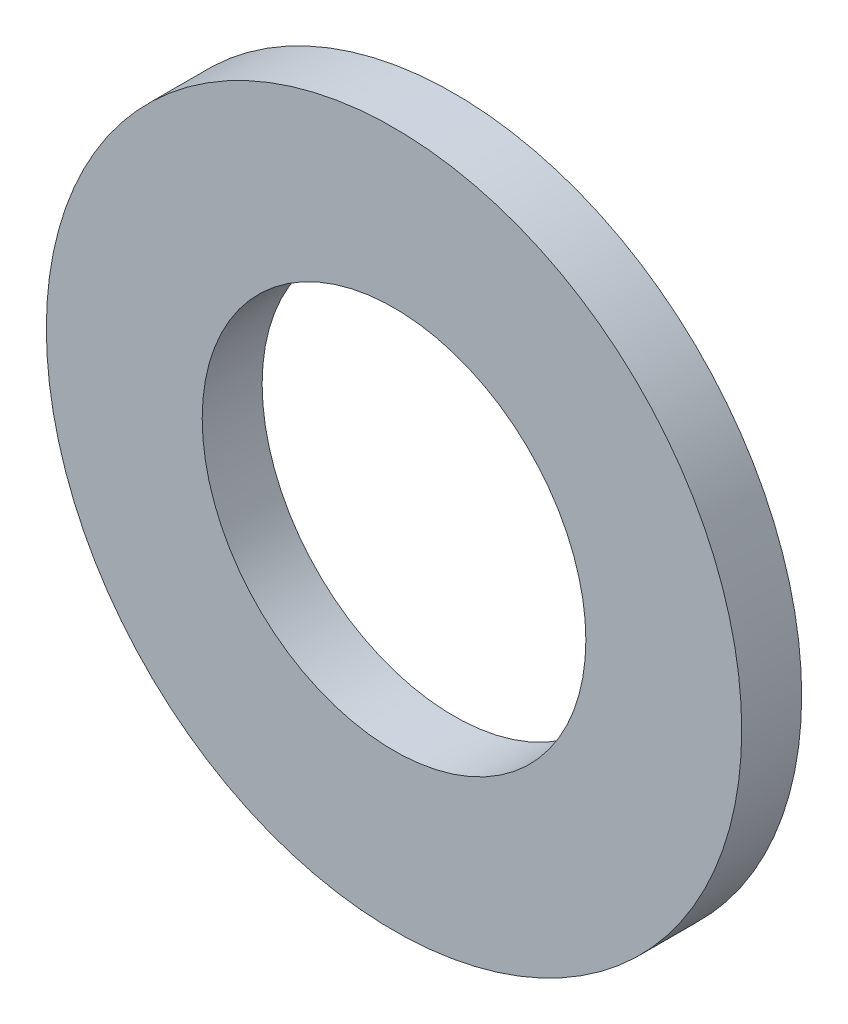
ISO-10303-21;
HEADER;
FILE_DESCRIPTION(('STEP AP214'),'2;1');
FILE_NAME('part.step','',(''),(''),'','','');
FILE_SCHEMA(('AUTOMOTIVE_DESIGN { 1 0 10303 214 1 1 1 1 }'));
ENDSEC;
DATA;
#1=APPLICATION_CONTEXT('core data for automotive mechanical design processes');
#2=APPLICATION_PROTOCOL_DEFINITION('international standard','automotive_design',2000,#1);
#3=PRODUCT_CONTEXT('',#1,'mechanical');
#4=PRODUCT('Part','Part','',(#3));
#5=PRODUCT_RELATED_PRODUCT_CATEGORY('part','',(#4));
#6=PRODUCT_DEFINITION_FORMATION('','',#4);
#7=PRODUCT_DEFINITION_CONTEXT('part definition',#1,'design');
#8=PRODUCT_DEFINITION('design','',#6,#7);
#9=PRODUCT_DEFINITION_SHAPE('','',#8);
#10=(LENGTH_UNIT() NAMED_UNIT(*) SI_UNIT(.MILLI.,.METRE.));
#11=(NAMED_UNIT(*) PLANE_ANGLE_UNIT() SI_UNIT($,.RADIAN.));
#12=(NAMED_UNIT(*) SI_UNIT($,.STERADIAN.) SOLID_ANGLE_UNIT());
#13=UNCERTAINTY_MEASURE_WITH_UNIT(LENGTH_MEASURE(1.E-05),#10,'distance_accuracy_value','');
#14=(GEOMETRIC_REPRESENTATION_CONTEXT(3) GLOBAL_UNCERTAINTY_ASSIGNED_CONTEXT((#13)) GLOBAL_UNIT_ASSIGNED_CONTEXT((#10,
#11,#12)) REPRESENTATION_CONTEXT('',''));
#15=CARTESIAN_POINT('',(0.,0.,0.));
#16=DIRECTION('',(0.,0.,1.));
#17=DIRECTION('',(1.,0.,0.));
#18=AXIS2_PLACEMENT_3D('',#15,#16,#17);
#19=CARTESIAN_POINT('',(0.,0.,0.));
#20=DIRECTION('',(0.,0.,1.));
#21=DIRECTION('',(1.,0.,0.));
#22=AXIS2_PLACEMENT_3D('',#19,#20,#21);
#23=PLANE('',#22);
#24=CARTESIAN_POINT('',(0.,0.,0.));
#25=DIRECTION('',(0.,0.,1.));
#26=DIRECTION('',(1.,0.,0.));
#27=AXIS2_PLACEMENT_3D('',#24,#25,#26);
#28=CIRCLE('',#27,1.6);
#29=CARTESIAN_POINT('',(1.6,0.,0.));
#30=VERTEX_POINT('',#29);
#31=EDGE_CURVE('E50',#30,#30,#28,.T.);
#32=ORIENTED_EDGE('',*,*,#31,.T.);
#33=EDGE_LOOP('',(#32));
#34=FACE_BOUND('',#33,.T.);
#35=CARTESIAN_POINT('',(0.,0.,-1.2E-05));
#36=DIRECTION('',(0.,0.,1.));
#37=DIRECTION('',(1.,0.,0.));
#38=AXIS2_PLACEMENT_3D('',#35,#36,#37);
#39=CIRCLE('',#38,2.9);
#40=CARTESIAN_POINT('',(2.9,0.,-1.2E-05));
#41=VERTEX_POINT('',#40);
#42=EDGE_CURVE('E55',#41,#41,#39,.T.);
#43=ORIENTED_EDGE('',*,*,#42,.F.);
#44=EDGE_LOOP('',(#43));
#45=FACE_BOUND('',#44,.T.);
#46=ADVANCED_FACE('F36',(#34,#45),#23,.F.);
#47=CARTESIAN_POINT('',(0.,0.,0.5));
#48=DIRECTION('',(0.,0.,1.));
#49=DIRECTION('',(1.,0.,0.));
#50=AXIS2_PLACEMENT_3D('',#47,#48,#49);
#51=PLANE('',#50);
#52=CARTESIAN_POINT('',(0.,0.,0.5));
#53=DIRECTION('',(0.,0.,1.));
#54=DIRECTION('',(1.,0.,0.));
#55=AXIS2_PLACEMENT_3D('',#52,#53,#54);
#56=CIRCLE('',#55,1.6);
#57=CARTESIAN_POINT('',(1.6,0.,0.5));
#58=VERTEX_POINT('',#57);
#59=EDGE_CURVE('E10',#58,#58,#56,.T.);
#60=ORIENTED_EDGE('',*,*,#59,.F.);
#61=EDGE_LOOP('',(#60));
#62=FACE_BOUND('',#61,.T.);
#63=CARTESIAN_POINT('',(0.,0.,0.5));
#64=DIRECTION('',(0.,0.,1.));
#65=DIRECTION('',(1.,0.,0.));
#66=AXIS2_PLACEMENT_3D('',#63,#64,#65);
#67=CIRCLE('',#66,2.9);
#68=CARTESIAN_POINT('',(2.9,0.,0.5));
#69=VERTEX_POINT('',#68);
#70=EDGE_CURVE('E64',#69,#69,#67,.T.);
#71=ORIENTED_EDGE('',*,*,#70,.T.);
#72=EDGE_LOOP('',(#71));
#73=FACE_BOUND('',#72,.T.);
#74=ADVANCED_FACE('F68',(#62,#73),#51,.T.);
#75=CARTESIAN_POINT('',(0.,0.,0.5));
#76=DIRECTION('',(0.,0.,-1.));
#77=DIRECTION('',(-1.,0.,0.));
#78=AXIS2_PLACEMENT_3D('',#75,#76,#77);
#79=CYLINDRICAL_SURFACE('',#78,1.6);
#80=ORIENTED_EDGE('',*,*,#59,.T.);
#81=EDGE_LOOP('',(#80));
#82=FACE_BOUND('',#81,.T.);
#83=ORIENTED_EDGE('',*,*,#31,.F.);
#84=EDGE_LOOP('',(#83));
#85=FACE_BOUND('',#84,.T.);
#86=ADVANCED_FACE('F75',(#82,#85),#79,.F.);
#87=CARTESIAN_POINT('',(0.,0.,-1.2E-05));
#88=DIRECTION('',(0.,0.,1.));
#89=DIRECTION('',(1.,0.,0.));
#90=AXIS2_PLACEMENT_3D('',#87,#88,#89);
#91=CYLINDRICAL_SURFACE('',#90,2.9);
#92=ORIENTED_EDGE('',*,*,#42,.T.);
#93=EDGE_LOOP('',(#92));
#94=FACE_BOUND('',#93,.T.);
#95=ORIENTED_EDGE('',*,*,#70,.F.);
#96=EDGE_LOOP('',(#95));
#97=FACE_BOUND('',#96,.T.);
#98=ADVANCED_FACE('F69',(#94,#97),#91,.T.);
#99=CLOSED_SHELL('',(#46,#74,#86,#98));
#100=MANIFOLD_SOLID_BREP('B2',#99);
#101=ADVANCED_BREP_SHAPE_REPRESENTATION('',(#18,#100),#14);
#102=SHAPE_DEFINITION_REPRESENTATION(#9,#101);
ENDSEC;
END-ISO-10303-21;
